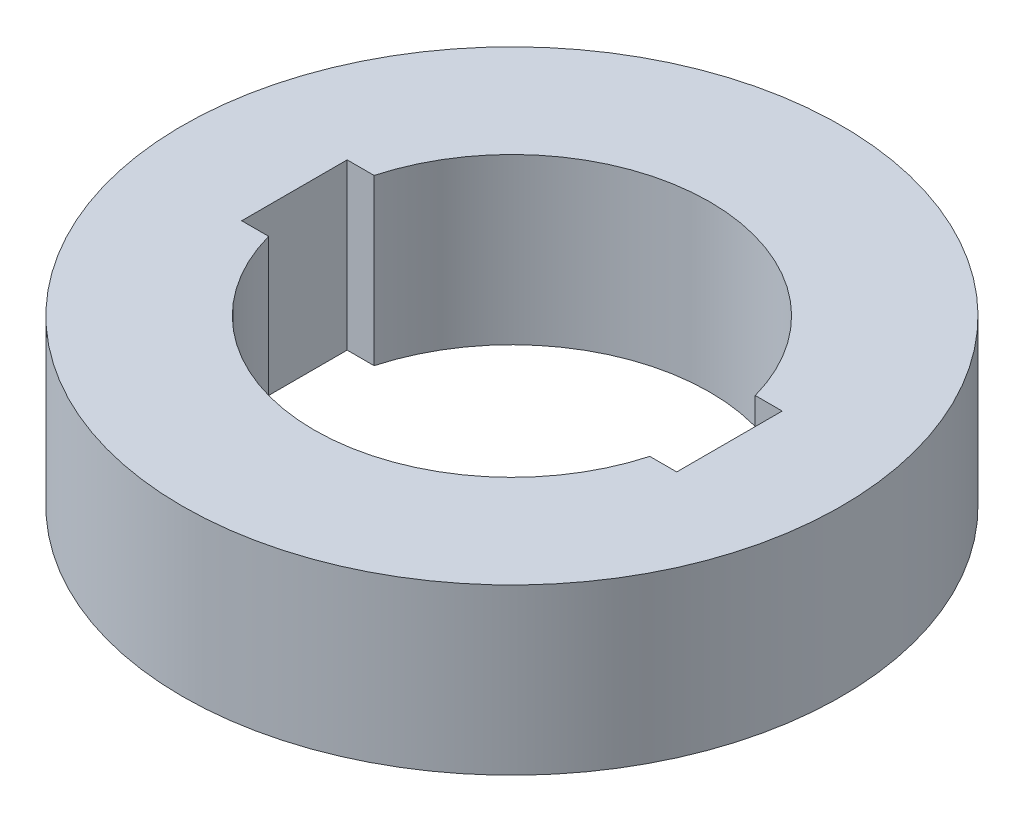
ISO-10303-21;
HEADER;
FILE_DESCRIPTION(('STEP AP214'),'2;1');
FILE_NAME('part.step','',(''),(''),'','','');
FILE_SCHEMA(('AUTOMOTIVE_DESIGN { 1 0 10303 214 1 1 1 1 }'));
ENDSEC;
DATA;
#1=APPLICATION_CONTEXT('core data for automotive mechanical design processes');
#2=APPLICATION_PROTOCOL_DEFINITION('international standard','automotive_design',2000,#1);
#3=PRODUCT_CONTEXT('',#1,'mechanical');
#4=PRODUCT('Part','Part','',(#3));
#5=PRODUCT_RELATED_PRODUCT_CATEGORY('part','',(#4));
#6=PRODUCT_DEFINITION_FORMATION('','',#4);
#7=PRODUCT_DEFINITION_CONTEXT('part definition',#1,'design');
#8=PRODUCT_DEFINITION('design','',#6,#7);
#9=PRODUCT_DEFINITION_SHAPE('','',#8);
#10=(LENGTH_UNIT() NAMED_UNIT(*) SI_UNIT(.MILLI.,.METRE.));
#11=(NAMED_UNIT(*) PLANE_ANGLE_UNIT() SI_UNIT($,.RADIAN.));
#12=(NAMED_UNIT(*) SI_UNIT($,.STERADIAN.) SOLID_ANGLE_UNIT());
#13=UNCERTAINTY_MEASURE_WITH_UNIT(LENGTH_MEASURE(1.E-05),#10,'distance_accuracy_value','');
#14=(GEOMETRIC_REPRESENTATION_CONTEXT(3) GLOBAL_UNCERTAINTY_ASSIGNED_CONTEXT((#13)) GLOBAL_UNIT_ASSIGNED_CONTEXT((#10,
#11,#12)) REPRESENTATION_CONTEXT('',''));
#15=CARTESIAN_POINT('',(0.,0.,0.));
#16=DIRECTION('',(0.,0.,1.));
#17=DIRECTION('',(1.,0.,0.));
#18=AXIS2_PLACEMENT_3D('',#15,#16,#17);
#19=CARTESIAN_POINT('',(0.,25.,0.));
#20=DIRECTION('',(0.,-1.,0.));
#21=DIRECTION('',(0.,0.,-1.));
#22=AXIS2_PLACEMENT_3D('',#19,#20,#21);
#23=CYLINDRICAL_SURFACE('',#22,30.);
#24=DIRECTION('',(0.,-1.,0.));
#25=VECTOR('',#24,1.);
#26=CARTESIAN_POINT('',(28.9136645896019,25.,-8.));
#27=LINE('',#26,#25);
#28=CARTESIAN_POINT('',(28.9136645896019,25.,-8.));
#29=VERTEX_POINT('',#28);
#30=CARTESIAN_POINT('',(28.9136645896019,0.,-8.));
#31=VERTEX_POINT('',#30);
#32=EDGE_CURVE('E11',#29,#31,#27,.T.);
#33=ORIENTED_EDGE('',*,*,#32,.F.);
#34=CARTESIAN_POINT('',(0.,25.,0.));
#35=DIRECTION('',(0.,1.,0.));
#36=DIRECTION('',(0.,0.,1.));
#37=AXIS2_PLACEMENT_3D('',#34,#35,#36);
#38=CIRCLE('',#37,30.);
#39=CARTESIAN_POINT('',(-28.9136645896019,25.,-8.));
#40=VERTEX_POINT('',#39);
#41=EDGE_CURVE('E152',#29,#40,#38,.T.);
#42=ORIENTED_EDGE('',*,*,#41,.T.);
#43=DIRECTION('',(0.,-1.,0.));
#44=VECTOR('',#43,1.);
#45=CARTESIAN_POINT('',(-28.9136645896019,25.,-8.));
#46=LINE('',#45,#44);
#47=CARTESIAN_POINT('',(-28.9136645896019,0.,-8.));
#48=VERTEX_POINT('',#47);
#49=EDGE_CURVE('E47',#48,#40,#46,.F.);
#50=ORIENTED_EDGE('',*,*,#49,.F.);
#51=CARTESIAN_POINT('',(0.,0.,0.));
#52=DIRECTION('',(0.,1.,0.));
#53=DIRECTION('',(0.,0.,1.));
#54=AXIS2_PLACEMENT_3D('',#51,#52,#53);
#55=CIRCLE('',#54,30.);
#56=EDGE_CURVE('E153',#31,#48,#55,.T.);
#57=ORIENTED_EDGE('',*,*,#56,.F.);
#58=EDGE_LOOP('',(#33,#42,#50,#57));
#59=FACE_BOUND('',#58,.T.);
#60=ADVANCED_FACE('F39',(#59),#23,.F.);
#61=CARTESIAN_POINT('',(0.,25.,0.));
#62=DIRECTION('',(0.,1.,0.));
#63=DIRECTION('',(0.,0.,1.));
#64=AXIS2_PLACEMENT_3D('',#61,#62,#63);
#65=PLANE('',#64);
#66=DIRECTION('',(-1.,0.,0.));
#67=VECTOR('',#66,1.);
#68=CARTESIAN_POINT('',(33.,25.,-8.00000000000001));
#69=LINE('',#68,#67);
#70=CARTESIAN_POINT('',(-33.,25.,-8.));
#71=VERTEX_POINT('',#70);
#72=EDGE_CURVE('E129',#40,#71,#69,.T.);
#73=ORIENTED_EDGE('',*,*,#72,.F.);
#74=ORIENTED_EDGE('',*,*,#41,.F.);
#75=CARTESIAN_POINT('',(33.,25.,-8.00000000000001));
#76=VERTEX_POINT('',#75);
#77=EDGE_CURVE('E127',#76,#29,#69,.T.);
#78=ORIENTED_EDGE('',*,*,#77,.F.);
#79=DIRECTION('',(0.,0.,-1.));
#80=VECTOR('',#79,1.);
#81=CARTESIAN_POINT('',(33.,25.,-8.00000000000001));
#82=LINE('',#81,#80);
#83=CARTESIAN_POINT('',(33.,25.,7.99999999999999));
#84=VERTEX_POINT('',#83);
#85=EDGE_CURVE('E139',#84,#76,#82,.T.);
#86=ORIENTED_EDGE('',*,*,#85,.F.);
#87=DIRECTION('',(1.,0.,0.));
#88=VECTOR('',#87,1.);
#89=CARTESIAN_POINT('',(33.,25.,7.99999999999999));
#90=LINE('',#89,#88);
#91=CARTESIAN_POINT('',(28.9136645896019,25.,8.));
#92=VERTEX_POINT('',#91);
#93=EDGE_CURVE('E137',#92,#84,#90,.T.);
#94=ORIENTED_EDGE('',*,*,#93,.F.);
#95=CARTESIAN_POINT('',(-28.9136645896019,25.,8.));
#96=VERTEX_POINT('',#95);
#97=EDGE_CURVE('E149',#96,#92,#38,.T.);
#98=ORIENTED_EDGE('',*,*,#97,.F.);
#99=CARTESIAN_POINT('',(-33.,25.,8.));
#100=VERTEX_POINT('',#99);
#101=EDGE_CURVE('E62',#100,#96,#90,.T.);
#102=ORIENTED_EDGE('',*,*,#101,.F.);
#103=DIRECTION('',(0.,0.,1.));
#104=VECTOR('',#103,1.);
#105=CARTESIAN_POINT('',(-33.,25.,-8.));
#106=LINE('',#105,#104);
#107=EDGE_CURVE('E111',#71,#100,#106,.T.);
#108=ORIENTED_EDGE('',*,*,#107,.F.);
#109=EDGE_LOOP('',(#73,#74,#78,#86,#94,#98,#102,#108));
#110=FACE_BOUND('',#109,.T.);
#111=CARTESIAN_POINT('',(0.,25.,0.));
#112=DIRECTION('',(0.,1.,0.));
#113=DIRECTION('',(0.,0.,1.));
#114=AXIS2_PLACEMENT_3D('',#111,#112,#113);
#115=CIRCLE('',#114,50.);
#116=CARTESIAN_POINT('',(0.,25.,50.));
#117=VERTEX_POINT('',#116);
#118=EDGE_CURVE('E155',#117,#117,#115,.T.);
#119=ORIENTED_EDGE('',*,*,#118,.T.);
#120=EDGE_LOOP('',(#119));
#121=FACE_BOUND('',#120,.T.);
#122=ADVANCED_FACE('F172',(#110,#121),#65,.T.);
#123=CARTESIAN_POINT('',(0.,0.,0.));
#124=DIRECTION('',(0.,1.,0.));
#125=DIRECTION('',(0.,0.,1.));
#126=AXIS2_PLACEMENT_3D('',#123,#124,#125);
#127=PLANE('',#126);
#128=CARTESIAN_POINT('',(0.,0.,0.));
#129=DIRECTION('',(0.,1.,0.));
#130=DIRECTION('',(0.,0.,1.));
#131=AXIS2_PLACEMENT_3D('',#128,#129,#130);
#132=CIRCLE('',#131,50.);
#133=CARTESIAN_POINT('',(0.,0.,50.));
#134=VERTEX_POINT('',#133);
#135=EDGE_CURVE('E159',#134,#134,#132,.T.);
#136=ORIENTED_EDGE('',*,*,#135,.F.);
#137=EDGE_LOOP('',(#136));
#138=FACE_BOUND('',#137,.T.);
#139=ORIENTED_EDGE('',*,*,#56,.T.);
#140=DIRECTION('',(-1.,0.,0.));
#141=VECTOR('',#140,1.);
#142=CARTESIAN_POINT('',(33.,0.,-8.00000000000001));
#143=LINE('',#142,#141);
#144=CARTESIAN_POINT('',(-33.,0.,-8.));
#145=VERTEX_POINT('',#144);
#146=EDGE_CURVE('E126',#48,#145,#143,.T.);
#147=ORIENTED_EDGE('',*,*,#146,.T.);
#148=DIRECTION('',(0.,0.,1.));
#149=VECTOR('',#148,1.);
#150=CARTESIAN_POINT('',(-33.,0.,-8.));
#151=LINE('',#150,#149);
#152=CARTESIAN_POINT('',(-33.,0.,8.));
#153=VERTEX_POINT('',#152);
#154=EDGE_CURVE('E108',#145,#153,#151,.T.);
#155=ORIENTED_EDGE('',*,*,#154,.T.);
#156=DIRECTION('',(1.,0.,0.));
#157=VECTOR('',#156,1.);
#158=CARTESIAN_POINT('',(33.,0.,7.99999999999999));
#159=LINE('',#158,#157);
#160=CARTESIAN_POINT('',(-28.9136645896019,0.,8.));
#161=VERTEX_POINT('',#160);
#162=EDGE_CURVE('E116',#153,#161,#159,.T.);
#163=ORIENTED_EDGE('',*,*,#162,.T.);
#164=CARTESIAN_POINT('',(28.9136645896019,0.,8.));
#165=VERTEX_POINT('',#164);
#166=EDGE_CURVE('E144',#161,#165,#55,.T.);
#167=ORIENTED_EDGE('',*,*,#166,.T.);
#168=CARTESIAN_POINT('',(33.,0.,7.99999999999999));
#169=VERTEX_POINT('',#168);
#170=EDGE_CURVE('E54',#165,#169,#159,.T.);
#171=ORIENTED_EDGE('',*,*,#170,.T.);
#172=DIRECTION('',(0.,0.,-1.));
#173=VECTOR('',#172,1.);
#174=CARTESIAN_POINT('',(33.,0.,-8.00000000000001));
#175=LINE('',#174,#173);
#176=CARTESIAN_POINT('',(33.,0.,-8.00000000000001));
#177=VERTEX_POINT('',#176);
#178=EDGE_CURVE('E122',#169,#177,#175,.T.);
#179=ORIENTED_EDGE('',*,*,#178,.T.);
#180=EDGE_CURVE('E113',#177,#31,#143,.T.);
#181=ORIENTED_EDGE('',*,*,#180,.T.);
#182=EDGE_LOOP('',(#139,#147,#155,#163,#167,#171,#179,#181));
#183=FACE_BOUND('',#182,.T.);
#184=ADVANCED_FACE('F125',(#138,#183),#127,.F.);
#185=CARTESIAN_POINT('',(0.,25.,0.));
#186=DIRECTION('',(0.,-1.,0.));
#187=DIRECTION('',(0.,0.,-1.));
#188=AXIS2_PLACEMENT_3D('',#185,#186,#187);
#189=CYLINDRICAL_SURFACE('',#188,50.);
#190=ORIENTED_EDGE('',*,*,#118,.F.);
#191=EDGE_LOOP('',(#190));
#192=FACE_BOUND('',#191,.T.);
#193=ORIENTED_EDGE('',*,*,#135,.T.);
#194=EDGE_LOOP('',(#193));
#195=FACE_BOUND('',#194,.T.);
#196=ADVANCED_FACE('F41',(#192,#195),#189,.T.);
#197=DIRECTION('',(0.,-1.,0.));
#198=VECTOR('',#197,1.);
#199=CARTESIAN_POINT('',(-28.9136645896019,25.,8.));
#200=LINE('',#199,#198);
#201=EDGE_CURVE('E118',#96,#161,#200,.T.);
#202=ORIENTED_EDGE('',*,*,#201,.F.);
#203=ORIENTED_EDGE('',*,*,#97,.T.);
#204=DIRECTION('',(0.,-1.,0.));
#205=VECTOR('',#204,1.);
#206=CARTESIAN_POINT('',(28.9136645896019,25.,8.));
#207=LINE('',#206,#205);
#208=EDGE_CURVE('E158',#165,#92,#207,.F.);
#209=ORIENTED_EDGE('',*,*,#208,.F.);
#210=ORIENTED_EDGE('',*,*,#166,.F.);
#211=EDGE_LOOP('',(#202,#203,#209,#210));
#212=FACE_BOUND('',#211,.T.);
#213=ADVANCED_FACE('F186',(#212),#23,.F.);
#214=CARTESIAN_POINT('',(33.,0.,-8.00000000000001));
#215=DIRECTION('',(0.,0.,-1.));
#216=DIRECTION('',(-1.,0.,0.));
#217=AXIS2_PLACEMENT_3D('',#214,#215,#216);
#218=PLANE('',#217);
#219=ORIENTED_EDGE('',*,*,#32,.T.);
#220=ORIENTED_EDGE('',*,*,#180,.F.);
#221=DIRECTION('',(0.,1.,0.));
#222=VECTOR('',#221,1.);
#223=CARTESIAN_POINT('',(33.,0.,-8.00000000000001));
#224=LINE('',#223,#222);
#225=EDGE_CURVE('E145',#177,#76,#224,.T.);
#226=ORIENTED_EDGE('',*,*,#225,.T.);
#227=ORIENTED_EDGE('',*,*,#77,.T.);
#228=EDGE_LOOP('',(#219,#220,#226,#227));
#229=FACE_BOUND('',#228,.T.);
#230=ADVANCED_FACE('F178',(#229),#218,.F.);
#231=CARTESIAN_POINT('',(33.,0.,7.99999999999999));
#232=DIRECTION('',(0.,0.,1.));
#233=DIRECTION('',(1.,0.,0.));
#234=AXIS2_PLACEMENT_3D('',#231,#232,#233);
#235=PLANE('',#234);
#236=ORIENTED_EDGE('',*,*,#208,.T.);
#237=ORIENTED_EDGE('',*,*,#93,.T.);
#238=DIRECTION('',(0.,1.,0.));
#239=VECTOR('',#238,1.);
#240=CARTESIAN_POINT('',(33.,0.,7.99999999999999));
#241=LINE('',#240,#239);
#242=EDGE_CURVE('E112',#169,#84,#241,.T.);
#243=ORIENTED_EDGE('',*,*,#242,.F.);
#244=ORIENTED_EDGE('',*,*,#170,.F.);
#245=EDGE_LOOP('',(#236,#237,#243,#244));
#246=FACE_BOUND('',#245,.T.);
#247=ADVANCED_FACE('F187',(#246),#235,.F.);
#248=CARTESIAN_POINT('',(33.,0.,-8.00000000000001));
#249=DIRECTION('',(1.,0.,0.));
#250=DIRECTION('',(0.,0.,-1.));
#251=AXIS2_PLACEMENT_3D('',#248,#249,#250);
#252=PLANE('',#251);
#253=ORIENTED_EDGE('',*,*,#85,.T.);
#254=ORIENTED_EDGE('',*,*,#225,.F.);
#255=ORIENTED_EDGE('',*,*,#178,.F.);
#256=ORIENTED_EDGE('',*,*,#242,.T.);
#257=EDGE_LOOP('',(#253,#254,#255,#256));
#258=FACE_BOUND('',#257,.T.);
#259=ADVANCED_FACE('F181',(#258),#252,.F.);
#260=ORIENTED_EDGE('',*,*,#201,.T.);
#261=ORIENTED_EDGE('',*,*,#162,.F.);
#262=DIRECTION('',(0.,1.,0.));
#263=VECTOR('',#262,1.);
#264=CARTESIAN_POINT('',(-33.,0.,8.));
#265=LINE('',#264,#263);
#266=EDGE_CURVE('E103',#153,#100,#265,.T.);
#267=ORIENTED_EDGE('',*,*,#266,.T.);
#268=ORIENTED_EDGE('',*,*,#101,.T.);
#269=EDGE_LOOP('',(#260,#261,#267,#268));
#270=FACE_BOUND('',#269,.T.);
#271=ADVANCED_FACE('F117',(#270),#235,.F.);
#272=CARTESIAN_POINT('',(-33.,0.,-8.));
#273=DIRECTION('',(-1.,0.,0.));
#274=DIRECTION('',(0.,0.,1.));
#275=AXIS2_PLACEMENT_3D('',#272,#273,#274);
#276=PLANE('',#275);
#277=ORIENTED_EDGE('',*,*,#107,.T.);
#278=ORIENTED_EDGE('',*,*,#266,.F.);
#279=ORIENTED_EDGE('',*,*,#154,.F.);
#280=DIRECTION('',(0.,1.,0.));
#281=VECTOR('',#280,1.);
#282=CARTESIAN_POINT('',(-33.,0.,-8.));
#283=LINE('',#282,#281);
#284=EDGE_CURVE('E142',#145,#71,#283,.T.);
#285=ORIENTED_EDGE('',*,*,#284,.T.);
#286=EDGE_LOOP('',(#277,#278,#279,#285));
#287=FACE_BOUND('',#286,.T.);
#288=ADVANCED_FACE('F105',(#287),#276,.F.);
#289=ORIENTED_EDGE('',*,*,#49,.T.);
#290=ORIENTED_EDGE('',*,*,#72,.T.);
#291=ORIENTED_EDGE('',*,*,#284,.F.);
#292=ORIENTED_EDGE('',*,*,#146,.F.);
#293=EDGE_LOOP('',(#289,#290,#291,#292));
#294=FACE_BOUND('',#293,.T.);
#295=ADVANCED_FACE('F166',(#294),#218,.F.);
#296=CLOSED_SHELL('',(#60,#122,#184,#196,#213,#230,#247,#259,#271,#288,#295));
#297=MANIFOLD_SOLID_BREP('B2',#296);
#298=ADVANCED_BREP_SHAPE_REPRESENTATION('',(#18,#297),#14);
#299=SHAPE_DEFINITION_REPRESENTATION(#9,#298);
ENDSEC;
END-ISO-10303-21;
